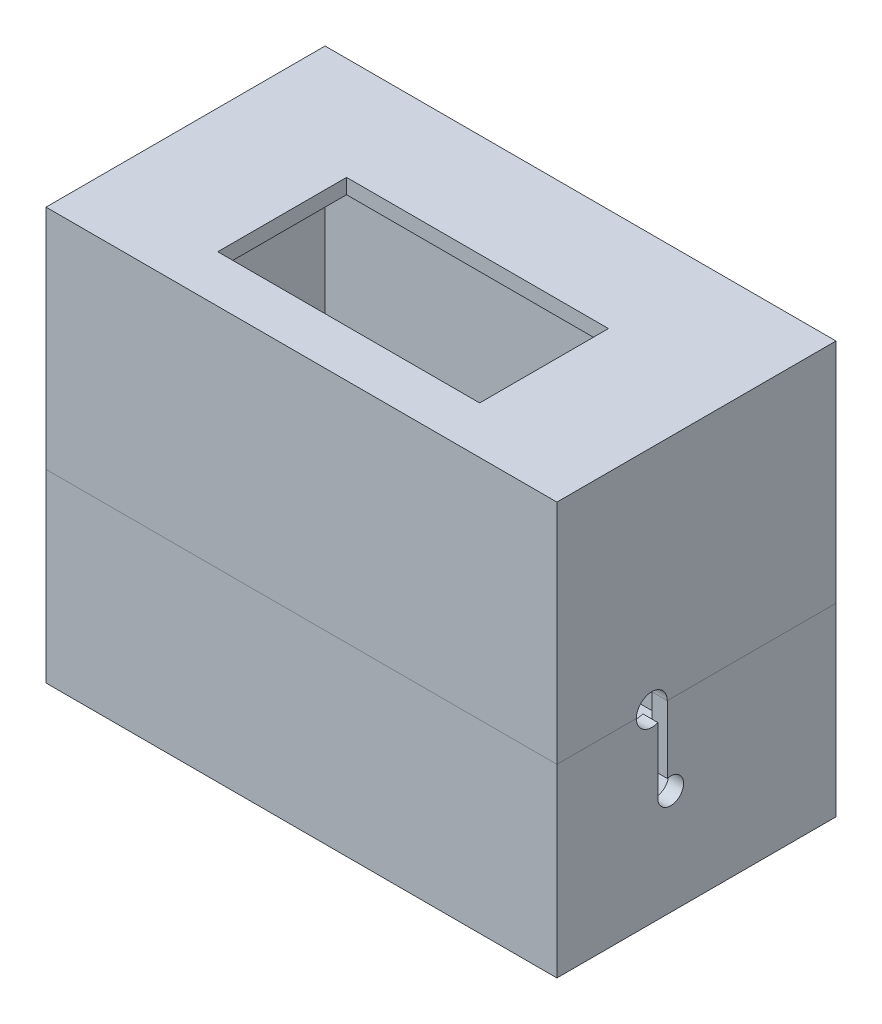
ISO-10303-21;
HEADER;
FILE_DESCRIPTION(('STEP AP214'),'2;1');
FILE_NAME('part.step','',(''),(''),'','','');
FILE_SCHEMA(('AUTOMOTIVE_DESIGN { 1 0 10303 214 1 1 1 1 }'));
ENDSEC;
DATA;
#1=APPLICATION_CONTEXT('core data for automotive mechanical design processes');
#2=APPLICATION_PROTOCOL_DEFINITION('international standard','automotive_design',2000,#1);
#3=PRODUCT_CONTEXT('',#1,'mechanical');
#4=PRODUCT('Part','Part','',(#3));
#5=PRODUCT_RELATED_PRODUCT_CATEGORY('part','',(#4));
#6=PRODUCT_DEFINITION_FORMATION('','',#4);
#7=PRODUCT_DEFINITION_CONTEXT('part definition',#1,'design');
#8=PRODUCT_DEFINITION('design','',#6,#7);
#9=PRODUCT_DEFINITION_SHAPE('','',#8);
#10=(LENGTH_UNIT() NAMED_UNIT(*) SI_UNIT(.MILLI.,.METRE.));
#11=(NAMED_UNIT(*) PLANE_ANGLE_UNIT() SI_UNIT($,.RADIAN.));
#12=(NAMED_UNIT(*) SI_UNIT($,.STERADIAN.) SOLID_ANGLE_UNIT());
#13=UNCERTAINTY_MEASURE_WITH_UNIT(LENGTH_MEASURE(1.E-05),#10,'distance_accuracy_value','');
#14=(GEOMETRIC_REPRESENTATION_CONTEXT(3) GLOBAL_UNCERTAINTY_ASSIGNED_CONTEXT((#13)) GLOBAL_UNIT_ASSIGNED_CONTEXT((#10,
#11,#12)) REPRESENTATION_CONTEXT('',''));
#15=CARTESIAN_POINT('',(0.,0.,0.));
#16=DIRECTION('',(0.,0.,1.));
#17=DIRECTION('',(1.,0.,0.));
#18=AXIS2_PLACEMENT_3D('',#15,#16,#17);
#19=CARTESIAN_POINT('',(0.,39.6,0.));
#20=DIRECTION('',(0.,-1.,0.));
#21=DIRECTION('',(0.,0.,-1.));
#22=AXIS2_PLACEMENT_3D('',#19,#20,#21);
#23=PLANE('',#22);
#24=DIRECTION('',(0.,0.,1.));
#25=VECTOR('',#24,1.);
#26=CARTESIAN_POINT('',(56.,39.6,29.));
#27=LINE('',#26,#25);
#28=CARTESIAN_POINT('',(56.,39.6,-29.));
#29=VERTEX_POINT('',#28);
#30=CARTESIAN_POINT('',(56.,39.6,6.8));
#31=VERTEX_POINT('',#30);
#32=EDGE_CURVE('E176',#29,#31,#27,.T.);
#33=ORIENTED_EDGE('',*,*,#32,.F.);
#34=DIRECTION('',(1.,0.,0.));
#35=VECTOR('',#34,1.);
#36=CARTESIAN_POINT('',(56.,39.6,-29.));
#37=LINE('',#36,#35);
#38=CARTESIAN_POINT('',(-56.,39.6,-29.));
#39=VERTEX_POINT('',#38);
#40=EDGE_CURVE('E239',#39,#29,#37,.T.);
#41=ORIENTED_EDGE('',*,*,#40,.F.);
#42=DIRECTION('',(0.,0.,-1.));
#43=VECTOR('',#42,1.);
#44=CARTESIAN_POINT('',(-56.,39.6,29.));
#45=LINE('',#44,#43);
#46=CARTESIAN_POINT('',(-56.,39.6,29.));
#47=VERTEX_POINT('',#46);
#48=EDGE_CURVE('E245',#47,#39,#45,.T.);
#49=ORIENTED_EDGE('',*,*,#48,.F.);
#50=DIRECTION('',(-1.,0.,0.));
#51=VECTOR('',#50,1.);
#52=CARTESIAN_POINT('',(56.,39.6,29.));
#53=LINE('',#52,#51);
#54=CARTESIAN_POINT('',(56.,39.6,29.));
#55=VERTEX_POINT('',#54);
#56=EDGE_CURVE('E242',#55,#47,#53,.T.);
#57=ORIENTED_EDGE('',*,*,#56,.F.);
#58=CARTESIAN_POINT('',(56.,39.6,14.));
#59=VERTEX_POINT('',#58);
#60=EDGE_CURVE('E249',#59,#55,#27,.T.);
#61=ORIENTED_EDGE('',*,*,#60,.F.);
#62=DIRECTION('',(-1.,0.,0.));
#63=VECTOR('',#62,1.);
#64=CARTESIAN_POINT('',(59.501,39.6,14.));
#65=LINE('',#64,#63);
#66=CARTESIAN_POINT('',(59.5,39.6,14.));
#67=VERTEX_POINT('',#66);
#68=EDGE_CURVE('E235',#67,#59,#65,.T.);
#69=ORIENTED_EDGE('',*,*,#68,.F.);
#70=DIRECTION('',(0.,0.,1.));
#71=VECTOR('',#70,1.);
#72=CARTESIAN_POINT('',(59.5,39.6,29.));
#73=LINE('',#72,#71);
#74=CARTESIAN_POINT('',(59.5,39.6,32.5));
#75=VERTEX_POINT('',#74);
#76=EDGE_CURVE('E161',#67,#75,#73,.T.);
#77=ORIENTED_EDGE('',*,*,#76,.T.);
#78=DIRECTION('',(-1.,0.,0.));
#79=VECTOR('',#78,1.);
#80=CARTESIAN_POINT('',(56.,39.6,32.5));
#81=LINE('',#80,#79);
#82=CARTESIAN_POINT('',(-59.5,39.6,32.5));
#83=VERTEX_POINT('',#82);
#84=EDGE_CURVE('E184',#75,#83,#81,.T.);
#85=ORIENTED_EDGE('',*,*,#84,.T.);
#86=DIRECTION('',(0.,0.,-1.));
#87=VECTOR('',#86,1.);
#88=CARTESIAN_POINT('',(-59.5,39.6,29.));
#89=LINE('',#88,#87);
#90=CARTESIAN_POINT('',(-59.5,39.6,-32.5));
#91=VERTEX_POINT('',#90);
#92=EDGE_CURVE('E253',#83,#91,#89,.T.);
#93=ORIENTED_EDGE('',*,*,#92,.T.);
#94=DIRECTION('',(1.,0.,0.));
#95=VECTOR('',#94,1.);
#96=CARTESIAN_POINT('',(56.,39.6,-32.5));
#97=LINE('',#96,#95);
#98=CARTESIAN_POINT('',(59.5,39.6,-32.5));
#99=VERTEX_POINT('',#98);
#100=EDGE_CURVE('E174',#91,#99,#97,.T.);
#101=ORIENTED_EDGE('',*,*,#100,.T.);
#102=CARTESIAN_POINT('',(59.5,39.6,6.8));
#103=VERTEX_POINT('',#102);
#104=EDGE_CURVE('E158',#99,#103,#73,.T.);
#105=ORIENTED_EDGE('',*,*,#104,.T.);
#106=DIRECTION('',(-1.,0.,0.));
#107=VECTOR('',#106,1.);
#108=CARTESIAN_POINT('',(59.501,39.6,6.8));
#109=LINE('',#108,#107);
#110=EDGE_CURVE('E171',#103,#31,#109,.T.);
#111=ORIENTED_EDGE('',*,*,#110,.T.);
#112=EDGE_LOOP('',(#33,#41,#49,#57,#61,#69,#77,#85,#93,#101,#105,#111));
#113=FACE_BOUND('',#112,.T.);
#114=ADVANCED_FACE('F48',(#113),#23,.T.);
#115=CARTESIAN_POINT('',(56.,89.,29.));
#116=DIRECTION('',(-1.,0.,0.));
#117=DIRECTION('',(0.,0.,1.));
#118=AXIS2_PLACEMENT_3D('',#115,#116,#117);
#119=PLANE('',#118);
#120=DIRECTION('',(0.,-1.,0.));
#121=VECTOR('',#120,1.);
#122=CARTESIAN_POINT('',(56.,89.,-29.));
#123=LINE('',#122,#121);
#124=CARTESIAN_POINT('',(56.,89.,-29.));
#125=VERTEX_POINT('',#124);
#126=EDGE_CURVE('E259',#125,#29,#123,.T.);
#127=ORIENTED_EDGE('',*,*,#126,.T.);
#128=ORIENTED_EDGE('',*,*,#32,.T.);
#129=CARTESIAN_POINT('',(56.,39.6,10.4));
#130=DIRECTION('',(1.,0.,0.));
#131=DIRECTION('',(0.,0.,-1.));
#132=AXIS2_PLACEMENT_3D('',#129,#130,#131);
#133=CIRCLE('',#132,3.6);
#134=EDGE_CURVE('E167',#31,#59,#133,.T.);
#135=ORIENTED_EDGE('',*,*,#134,.T.);
#136=ORIENTED_EDGE('',*,*,#60,.T.);
#137=DIRECTION('',(0.,-1.,0.));
#138=VECTOR('',#137,1.);
#139=CARTESIAN_POINT('',(56.,89.,29.));
#140=LINE('',#139,#138);
#141=CARTESIAN_POINT('',(56.,89.,29.));
#142=VERTEX_POINT('',#141);
#143=EDGE_CURVE('E263',#142,#55,#140,.T.);
#144=ORIENTED_EDGE('',*,*,#143,.F.);
#145=DIRECTION('',(0.,0.,-1.));
#146=VECTOR('',#145,1.);
#147=CARTESIAN_POINT('',(56.,89.,29.));
#148=LINE('',#147,#146);
#149=EDGE_CURVE('E296',#142,#125,#148,.T.);
#150=ORIENTED_EDGE('',*,*,#149,.T.);
#151=EDGE_LOOP('',(#127,#128,#135,#136,#144,#150));
#152=FACE_BOUND('',#151,.T.);
#153=ADVANCED_FACE('F321',(#152),#119,.T.);
#154=CARTESIAN_POINT('',(-56.,89.,29.));
#155=DIRECTION('',(1.,0.,0.));
#156=DIRECTION('',(0.,0.,-1.));
#157=AXIS2_PLACEMENT_3D('',#154,#155,#156);
#158=PLANE('',#157);
#159=DIRECTION('',(0.,-1.,0.));
#160=VECTOR('',#159,1.);
#161=CARTESIAN_POINT('',(-56.,89.,29.));
#162=LINE('',#161,#160);
#163=CARTESIAN_POINT('',(-56.,89.,29.));
#164=VERTEX_POINT('',#163);
#165=EDGE_CURVE('E268',#164,#47,#162,.T.);
#166=ORIENTED_EDGE('',*,*,#165,.T.);
#167=ORIENTED_EDGE('',*,*,#48,.T.);
#168=DIRECTION('',(0.,-1.,0.));
#169=VECTOR('',#168,1.);
#170=CARTESIAN_POINT('',(-56.,89.,-29.));
#171=LINE('',#170,#169);
#172=CARTESIAN_POINT('',(-56.,89.,-29.));
#173=VERTEX_POINT('',#172);
#174=EDGE_CURVE('E272',#173,#39,#171,.T.);
#175=ORIENTED_EDGE('',*,*,#174,.F.);
#176=DIRECTION('',(0.,0.,1.));
#177=VECTOR('',#176,1.);
#178=CARTESIAN_POINT('',(-56.,89.,29.));
#179=LINE('',#178,#177);
#180=EDGE_CURVE('E264',#173,#164,#179,.T.);
#181=ORIENTED_EDGE('',*,*,#180,.T.);
#182=EDGE_LOOP('',(#166,#167,#175,#181));
#183=FACE_BOUND('',#182,.T.);
#184=ADVANCED_FACE('F308',(#183),#158,.T.);
#185=CARTESIAN_POINT('',(56.,89.,29.));
#186=DIRECTION('',(0.,0.,-1.));
#187=DIRECTION('',(-1.,0.,0.));
#188=AXIS2_PLACEMENT_3D('',#185,#186,#187);
#189=PLANE('',#188);
#190=ORIENTED_EDGE('',*,*,#143,.T.);
#191=ORIENTED_EDGE('',*,*,#56,.T.);
#192=ORIENTED_EDGE('',*,*,#165,.F.);
#193=DIRECTION('',(1.,0.,0.));
#194=VECTOR('',#193,1.);
#195=CARTESIAN_POINT('',(56.,89.,29.));
#196=LINE('',#195,#194);
#197=EDGE_CURVE('E299',#164,#142,#196,.T.);
#198=ORIENTED_EDGE('',*,*,#197,.T.);
#199=EDGE_LOOP('',(#190,#191,#192,#198));
#200=FACE_BOUND('',#199,.T.);
#201=ADVANCED_FACE('F50',(#200),#189,.T.);
#202=CARTESIAN_POINT('',(56.,89.,-29.));
#203=DIRECTION('',(0.,0.,1.));
#204=DIRECTION('',(1.,0.,0.));
#205=AXIS2_PLACEMENT_3D('',#202,#203,#204);
#206=PLANE('',#205);
#207=ORIENTED_EDGE('',*,*,#174,.T.);
#208=ORIENTED_EDGE('',*,*,#40,.T.);
#209=ORIENTED_EDGE('',*,*,#126,.F.);
#210=DIRECTION('',(-1.,0.,0.));
#211=VECTOR('',#210,1.);
#212=CARTESIAN_POINT('',(56.,89.,-29.));
#213=LINE('',#212,#211);
#214=EDGE_CURVE('E238',#125,#173,#213,.T.);
#215=ORIENTED_EDGE('',*,*,#214,.T.);
#216=EDGE_LOOP('',(#207,#208,#209,#215));
#217=FACE_BOUND('',#216,.T.);
#218=ADVANCED_FACE('F316',(#217),#206,.T.);
#219=CARTESIAN_POINT('',(59.501,39.6,10.4));
#220=DIRECTION('',(-1.,0.,0.));
#221=DIRECTION('',(0.,0.,1.));
#222=AXIS2_PLACEMENT_3D('',#219,#220,#221);
#223=CYLINDRICAL_SURFACE('',#222,3.6);
#224=CARTESIAN_POINT('',(59.5,39.6,10.4));
#225=DIRECTION('',(-1.,0.,0.));
#226=DIRECTION('',(0.,0.,1.));
#227=AXIS2_PLACEMENT_3D('',#224,#225,#226);
#228=CIRCLE('',#227,3.6);
#229=EDGE_CURVE('E52',#67,#103,#228,.T.);
#230=ORIENTED_EDGE('',*,*,#229,.F.);
#231=ORIENTED_EDGE('',*,*,#68,.T.);
#232=ORIENTED_EDGE('',*,*,#134,.F.);
#233=ORIENTED_EDGE('',*,*,#110,.F.);
#234=EDGE_LOOP('',(#230,#231,#232,#233));
#235=FACE_BOUND('',#234,.T.);
#236=ADVANCED_FACE('F178',(#235),#223,.F.);
#237=CARTESIAN_POINT('',(59.5,89.,29.));
#238=DIRECTION('',(-1.,0.,0.));
#239=DIRECTION('',(0.,0.,1.));
#240=AXIS2_PLACEMENT_3D('',#237,#238,#239);
#241=PLANE('',#240);
#242=ORIENTED_EDGE('',*,*,#104,.F.);
#243=DIRECTION('',(0.,-1.,0.));
#244=VECTOR('',#243,1.);
#245=CARTESIAN_POINT('',(59.5,89.,-32.5));
#246=LINE('',#245,#244);
#247=CARTESIAN_POINT('',(59.5,92.5,-32.5));
#248=VERTEX_POINT('',#247);
#249=EDGE_CURVE('E281',#248,#99,#246,.T.);
#250=ORIENTED_EDGE('',*,*,#249,.F.);
#251=DIRECTION('',(0.,0.,-1.));
#252=VECTOR('',#251,1.);
#253=CARTESIAN_POINT('',(59.5,92.5,29.));
#254=LINE('',#253,#252);
#255=CARTESIAN_POINT('',(59.5,92.5,32.5));
#256=VERTEX_POINT('',#255);
#257=EDGE_CURVE('E201',#256,#248,#254,.T.);
#258=ORIENTED_EDGE('',*,*,#257,.F.);
#259=DIRECTION('',(0.,-1.,0.));
#260=VECTOR('',#259,1.);
#261=CARTESIAN_POINT('',(59.5,89.,32.5));
#262=LINE('',#261,#260);
#263=EDGE_CURVE('E279',#256,#75,#262,.T.);
#264=ORIENTED_EDGE('',*,*,#263,.T.);
#265=ORIENTED_EDGE('',*,*,#76,.F.);
#266=ORIENTED_EDGE('',*,*,#229,.T.);
#267=EDGE_LOOP('',(#242,#250,#258,#264,#265,#266));
#268=FACE_BOUND('',#267,.T.);
#269=ADVANCED_FACE('F156',(#268),#241,.F.);
#270=CARTESIAN_POINT('',(-59.5,89.,29.));
#271=DIRECTION('',(1.,0.,0.));
#272=DIRECTION('',(0.,0.,-1.));
#273=AXIS2_PLACEMENT_3D('',#270,#271,#272);
#274=PLANE('',#273);
#275=ORIENTED_EDGE('',*,*,#92,.F.);
#276=DIRECTION('',(0.,-1.,0.));
#277=VECTOR('',#276,1.);
#278=CARTESIAN_POINT('',(-59.5,89.,32.5));
#279=LINE('',#278,#277);
#280=CARTESIAN_POINT('',(-59.5,92.5,32.5));
#281=VERTEX_POINT('',#280);
#282=EDGE_CURVE('E276',#281,#83,#279,.T.);
#283=ORIENTED_EDGE('',*,*,#282,.F.);
#284=DIRECTION('',(0.,0.,1.));
#285=VECTOR('',#284,1.);
#286=CARTESIAN_POINT('',(-59.5,92.5,29.));
#287=LINE('',#286,#285);
#288=CARTESIAN_POINT('',(-59.5,92.5,-32.5));
#289=VERTEX_POINT('',#288);
#290=EDGE_CURVE('E190',#289,#281,#287,.T.);
#291=ORIENTED_EDGE('',*,*,#290,.F.);
#292=DIRECTION('',(0.,-1.,0.));
#293=VECTOR('',#292,1.);
#294=CARTESIAN_POINT('',(-59.5,89.,-32.5));
#295=LINE('',#294,#293);
#296=EDGE_CURVE('E187',#289,#91,#295,.T.);
#297=ORIENTED_EDGE('',*,*,#296,.T.);
#298=EDGE_LOOP('',(#275,#283,#291,#297));
#299=FACE_BOUND('',#298,.T.);
#300=ADVANCED_FACE('F328',(#299),#274,.F.);
#301=CARTESIAN_POINT('',(56.,89.,32.5));
#302=DIRECTION('',(0.,0.,-1.));
#303=DIRECTION('',(-1.,0.,0.));
#304=AXIS2_PLACEMENT_3D('',#301,#302,#303);
#305=PLANE('',#304);
#306=ORIENTED_EDGE('',*,*,#84,.F.);
#307=ORIENTED_EDGE('',*,*,#263,.F.);
#308=DIRECTION('',(1.,0.,0.));
#309=VECTOR('',#308,1.);
#310=CARTESIAN_POINT('',(56.,92.5,32.5));
#311=LINE('',#310,#309);
#312=EDGE_CURVE('E195',#281,#256,#311,.T.);
#313=ORIENTED_EDGE('',*,*,#312,.F.);
#314=ORIENTED_EDGE('',*,*,#282,.T.);
#315=EDGE_LOOP('',(#306,#307,#313,#314));
#316=FACE_BOUND('',#315,.T.);
#317=ADVANCED_FACE('F326',(#316),#305,.F.);
#318=CARTESIAN_POINT('',(56.,89.,-32.5));
#319=DIRECTION('',(0.,0.,1.));
#320=DIRECTION('',(1.,0.,0.));
#321=AXIS2_PLACEMENT_3D('',#318,#319,#320);
#322=PLANE('',#321);
#323=ORIENTED_EDGE('',*,*,#100,.F.);
#324=ORIENTED_EDGE('',*,*,#296,.F.);
#325=DIRECTION('',(-1.,0.,0.));
#326=VECTOR('',#325,1.);
#327=CARTESIAN_POINT('',(56.,92.5,-32.5));
#328=LINE('',#327,#326);
#329=EDGE_CURVE('E286',#248,#289,#328,.T.);
#330=ORIENTED_EDGE('',*,*,#329,.F.);
#331=ORIENTED_EDGE('',*,*,#249,.T.);
#332=EDGE_LOOP('',(#323,#324,#330,#331));
#333=FACE_BOUND('',#332,.T.);
#334=ADVANCED_FACE('F329',(#333),#322,.F.);
#335=CARTESIAN_POINT('',(0.,89.,0.));
#336=DIRECTION('',(0.,1.,0.));
#337=DIRECTION('',(0.,0.,1.));
#338=AXIS2_PLACEMENT_3D('',#335,#336,#337);
#339=PLANE('',#338);
#340=ORIENTED_EDGE('',*,*,#180,.F.);
#341=ORIENTED_EDGE('',*,*,#214,.F.);
#342=ORIENTED_EDGE('',*,*,#149,.F.);
#343=ORIENTED_EDGE('',*,*,#197,.F.);
#344=EDGE_LOOP('',(#340,#341,#342,#343));
#345=FACE_BOUND('',#344,.T.);
#346=DIRECTION('',(-1.,0.,0.));
#347=VECTOR('',#346,1.);
#348=CARTESIAN_POINT('',(-30.5,89.,21.5));
#349=LINE('',#348,#347);
#350=CARTESIAN_POINT('',(30.5,89.,21.5));
#351=VERTEX_POINT('',#350);
#352=CARTESIAN_POINT('',(-30.5,89.,21.5));
#353=VERTEX_POINT('',#352);
#354=EDGE_CURVE('E221',#351,#353,#349,.T.);
#355=ORIENTED_EDGE('',*,*,#354,.F.);
#356=DIRECTION('',(0.,0.,1.));
#357=VECTOR('',#356,1.);
#358=CARTESIAN_POINT('',(30.5,89.,-8.50000000000001));
#359=LINE('',#358,#357);
#360=CARTESIAN_POINT('',(30.5,89.,-8.50000000000001));
#361=VERTEX_POINT('',#360);
#362=EDGE_CURVE('E166',#361,#351,#359,.T.);
#363=ORIENTED_EDGE('',*,*,#362,.F.);
#364=DIRECTION('',(1.,0.,0.));
#365=VECTOR('',#364,1.);
#366=CARTESIAN_POINT('',(-30.5,89.,-8.50000000000001));
#367=LINE('',#366,#365);
#368=CARTESIAN_POINT('',(-30.5,89.,-8.50000000000001));
#369=VERTEX_POINT('',#368);
#370=EDGE_CURVE('E215',#369,#361,#367,.T.);
#371=ORIENTED_EDGE('',*,*,#370,.F.);
#372=DIRECTION('',(0.,0.,-1.));
#373=VECTOR('',#372,1.);
#374=CARTESIAN_POINT('',(-30.5,89.,-8.50000000000001));
#375=LINE('',#374,#373);
#376=EDGE_CURVE('E218',#353,#369,#375,.T.);
#377=ORIENTED_EDGE('',*,*,#376,.F.);
#378=EDGE_LOOP('',(#355,#363,#371,#377));
#379=FACE_BOUND('',#378,.T.);
#380=ADVANCED_FACE('F319',(#345,#379),#339,.F.);
#381=CARTESIAN_POINT('',(0.,92.5,0.));
#382=DIRECTION('',(0.,1.,0.));
#383=DIRECTION('',(0.,0.,1.));
#384=AXIS2_PLACEMENT_3D('',#381,#382,#383);
#385=PLANE('',#384);
#386=DIRECTION('',(0.,0.,1.));
#387=VECTOR('',#386,1.);
#388=CARTESIAN_POINT('',(-30.5,92.5,-8.50000000000001));
#389=LINE('',#388,#387);
#390=CARTESIAN_POINT('',(-30.5,92.5,-8.50000000000001));
#391=VERTEX_POINT('',#390);
#392=CARTESIAN_POINT('',(-30.5,92.5,21.5));
#393=VERTEX_POINT('',#392);
#394=EDGE_CURVE('E208',#391,#393,#389,.T.);
#395=ORIENTED_EDGE('',*,*,#394,.F.);
#396=DIRECTION('',(-1.,0.,0.));
#397=VECTOR('',#396,1.);
#398=CARTESIAN_POINT('',(-30.5,92.5,-8.50000000000001));
#399=LINE('',#398,#397);
#400=CARTESIAN_POINT('',(30.5,92.5,-8.50000000000001));
#401=VERTEX_POINT('',#400);
#402=EDGE_CURVE('E230',#401,#391,#399,.T.);
#403=ORIENTED_EDGE('',*,*,#402,.F.);
#404=DIRECTION('',(0.,0.,-1.));
#405=VECTOR('',#404,1.);
#406=CARTESIAN_POINT('',(30.5,92.5,-8.50000000000001));
#407=LINE('',#406,#405);
#408=CARTESIAN_POINT('',(30.5,92.5,21.5));
#409=VERTEX_POINT('',#408);
#410=EDGE_CURVE('E227',#409,#401,#407,.T.);
#411=ORIENTED_EDGE('',*,*,#410,.F.);
#412=DIRECTION('',(1.,0.,0.));
#413=VECTOR('',#412,1.);
#414=CARTESIAN_POINT('',(-30.5,92.5,21.5));
#415=LINE('',#414,#413);
#416=EDGE_CURVE('E224',#393,#409,#415,.T.);
#417=ORIENTED_EDGE('',*,*,#416,.F.);
#418=EDGE_LOOP('',(#395,#403,#411,#417));
#419=FACE_BOUND('',#418,.T.);
#420=ORIENTED_EDGE('',*,*,#290,.T.);
#421=ORIENTED_EDGE('',*,*,#312,.T.);
#422=ORIENTED_EDGE('',*,*,#257,.T.);
#423=ORIENTED_EDGE('',*,*,#329,.T.);
#424=EDGE_LOOP('',(#420,#421,#422,#423));
#425=FACE_BOUND('',#424,.T.);
#426=ADVANCED_FACE('F336',(#419,#425),#385,.T.);
#427=CARTESIAN_POINT('',(-30.5,-3.501,-8.50000000000001));
#428=DIRECTION('',(-1.,0.,0.));
#429=DIRECTION('',(0.,0.,1.));
#430=AXIS2_PLACEMENT_3D('',#427,#428,#429);
#431=PLANE('',#430);
#432=ORIENTED_EDGE('',*,*,#376,.T.);
#433=DIRECTION('',(0.,1.,0.));
#434=VECTOR('',#433,1.);
#435=CARTESIAN_POINT('',(-30.5,-3.501,-8.50000000000001));
#436=LINE('',#435,#434);
#437=EDGE_CURVE('E58',#369,#391,#436,.T.);
#438=ORIENTED_EDGE('',*,*,#437,.T.);
#439=ORIENTED_EDGE('',*,*,#394,.T.);
#440=DIRECTION('',(0.,1.,0.));
#441=VECTOR('',#440,1.);
#442=CARTESIAN_POINT('',(-30.5,-3.501,21.5));
#443=LINE('',#442,#441);
#444=EDGE_CURVE('E12',#353,#393,#443,.T.);
#445=ORIENTED_EDGE('',*,*,#444,.F.);
#446=EDGE_LOOP('',(#432,#438,#439,#445));
#447=FACE_BOUND('',#446,.T.);
#448=ADVANCED_FACE('F382',(#447),#431,.F.);
#449=CARTESIAN_POINT('',(-30.5,-3.501,-8.50000000000001));
#450=DIRECTION('',(0.,0.,-1.));
#451=DIRECTION('',(-1.,0.,0.));
#452=AXIS2_PLACEMENT_3D('',#449,#450,#451);
#453=PLANE('',#452);
#454=ORIENTED_EDGE('',*,*,#370,.T.);
#455=DIRECTION('',(0.,1.,0.));
#456=VECTOR('',#455,1.);
#457=CARTESIAN_POINT('',(30.5,-3.501,-8.50000000000001));
#458=LINE('',#457,#456);
#459=EDGE_CURVE('E207',#361,#401,#458,.T.);
#460=ORIENTED_EDGE('',*,*,#459,.T.);
#461=ORIENTED_EDGE('',*,*,#402,.T.);
#462=ORIENTED_EDGE('',*,*,#437,.F.);
#463=EDGE_LOOP('',(#454,#460,#461,#462));
#464=FACE_BOUND('',#463,.T.);
#465=ADVANCED_FACE('F392',(#464),#453,.F.);
#466=CARTESIAN_POINT('',(30.5,-3.501,-8.50000000000001));
#467=DIRECTION('',(1.,0.,0.));
#468=DIRECTION('',(0.,0.,-1.));
#469=AXIS2_PLACEMENT_3D('',#466,#467,#468);
#470=PLANE('',#469);
#471=ORIENTED_EDGE('',*,*,#362,.T.);
#472=DIRECTION('',(0.,1.,0.));
#473=VECTOR('',#472,1.);
#474=CARTESIAN_POINT('',(30.5,-3.501,21.5));
#475=LINE('',#474,#473);
#476=EDGE_CURVE('E81',#351,#409,#475,.T.);
#477=ORIENTED_EDGE('',*,*,#476,.T.);
#478=ORIENTED_EDGE('',*,*,#410,.T.);
#479=ORIENTED_EDGE('',*,*,#459,.F.);
#480=EDGE_LOOP('',(#471,#477,#478,#479));
#481=FACE_BOUND('',#480,.T.);
#482=ADVANCED_FACE('F401',(#481),#470,.F.);
#483=CARTESIAN_POINT('',(-30.5,-3.501,21.5));
#484=DIRECTION('',(0.,0.,1.));
#485=DIRECTION('',(1.,0.,0.));
#486=AXIS2_PLACEMENT_3D('',#483,#484,#485);
#487=PLANE('',#486);
#488=ORIENTED_EDGE('',*,*,#354,.T.);
#489=ORIENTED_EDGE('',*,*,#444,.T.);
#490=ORIENTED_EDGE('',*,*,#416,.T.);
#491=ORIENTED_EDGE('',*,*,#476,.F.);
#492=EDGE_LOOP('',(#488,#489,#490,#491));
#493=FACE_BOUND('',#492,.T.);
#494=ADVANCED_FACE('F348',(#493),#487,.F.);
#495=CLOSED_SHELL('',(#114,#153,#184,#201,#218,#236,#269,#300,#317,#334,#380,#426,#448,#465,
#482,#494));
#496=MANIFOLD_SOLID_BREP('B2',#495);
#497=CARTESIAN_POINT('',(0.,39.6,0.));
#498=DIRECTION('',(0.,-1.,0.));
#499=DIRECTION('',(0.,0.,-1.));
#500=AXIS2_PLACEMENT_3D('',#497,#498,#499);
#501=PLANE('',#500);
#502=DIRECTION('',(0.,0.,1.));
#503=VECTOR('',#502,1.);
#504=CARTESIAN_POINT('',(56.,39.6,29.));
#505=LINE('',#504,#503);
#506=CARTESIAN_POINT('',(56.,39.6,-29.));
#507=VERTEX_POINT('',#506);
#508=CARTESIAN_POINT('',(56.,39.6,6.8));
#509=VERTEX_POINT('',#508);
#510=EDGE_CURVE('E659',#507,#509,#505,.T.);
#511=ORIENTED_EDGE('',*,*,#510,.T.);
#512=DIRECTION('',(-1.,0.,0.));
#513=VECTOR('',#512,1.);
#514=CARTESIAN_POINT('',(59.501,39.6,6.8));
#515=LINE('',#514,#513);
#516=CARTESIAN_POINT('',(59.5,39.6,6.8));
#517=VERTEX_POINT('',#516);
#518=EDGE_CURVE('E609',#517,#509,#515,.T.);
#519=ORIENTED_EDGE('',*,*,#518,.F.);
#520=DIRECTION('',(0.,0.,1.));
#521=VECTOR('',#520,1.);
#522=CARTESIAN_POINT('',(59.5,39.6,29.));
#523=LINE('',#522,#521);
#524=CARTESIAN_POINT('',(59.5,39.6,-32.5));
#525=VERTEX_POINT('',#524);
#526=EDGE_CURVE('E657',#525,#517,#523,.T.);
#527=ORIENTED_EDGE('',*,*,#526,.F.);
#528=DIRECTION('',(1.,0.,0.));
#529=VECTOR('',#528,1.);
#530=CARTESIAN_POINT('',(56.,39.6,-32.5));
#531=LINE('',#530,#529);
#532=CARTESIAN_POINT('',(-59.5,39.6,-32.5));
#533=VERTEX_POINT('',#532);
#534=EDGE_CURVE('E634',#533,#525,#531,.T.);
#535=ORIENTED_EDGE('',*,*,#534,.F.);
#536=DIRECTION('',(0.,0.,-1.));
#537=VECTOR('',#536,1.);
#538=CARTESIAN_POINT('',(-59.5,39.6,29.));
#539=LINE('',#538,#537);
#540=CARTESIAN_POINT('',(-59.5,39.6,32.5));
#541=VERTEX_POINT('',#540);
#542=EDGE_CURVE('E654',#541,#533,#539,.T.);
#543=ORIENTED_EDGE('',*,*,#542,.F.);
#544=DIRECTION('',(-1.,0.,0.));
#545=VECTOR('',#544,1.);
#546=CARTESIAN_POINT('',(56.,39.6,32.5));
#547=LINE('',#546,#545);
#548=CARTESIAN_POINT('',(59.5,39.6,32.5));
#549=VERTEX_POINT('',#548);
#550=EDGE_CURVE('E653',#549,#541,#547,.T.);
#551=ORIENTED_EDGE('',*,*,#550,.F.);
#552=CARTESIAN_POINT('',(59.5,39.6,14.));
#553=VERTEX_POINT('',#552);
#554=EDGE_CURVE('E656',#553,#549,#523,.T.);
#555=ORIENTED_EDGE('',*,*,#554,.F.);
#556=DIRECTION('',(-1.,0.,0.));
#557=VECTOR('',#556,1.);
#558=CARTESIAN_POINT('',(59.501,39.6,14.));
#559=LINE('',#558,#557);
#560=CARTESIAN_POINT('',(56.,39.6,14.));
#561=VERTEX_POINT('',#560);
#562=EDGE_CURVE('E46',#553,#561,#559,.T.);
#563=ORIENTED_EDGE('',*,*,#562,.T.);
#564=CARTESIAN_POINT('',(56.,39.6,29.));
#565=VERTEX_POINT('',#564);
#566=EDGE_CURVE('E488',#561,#565,#505,.T.);
#567=ORIENTED_EDGE('',*,*,#566,.T.);
#568=DIRECTION('',(-1.,0.,0.));
#569=VECTOR('',#568,1.);
#570=CARTESIAN_POINT('',(56.,39.6,29.));
#571=LINE('',#570,#569);
#572=CARTESIAN_POINT('',(-56.,39.6,29.));
#573=VERTEX_POINT('',#572);
#574=EDGE_CURVE('E663',#565,#573,#571,.T.);
#575=ORIENTED_EDGE('',*,*,#574,.T.);
#576=DIRECTION('',(0.,0.,-1.));
#577=VECTOR('',#576,1.);
#578=CARTESIAN_POINT('',(-56.,39.6,29.));
#579=LINE('',#578,#577);
#580=CARTESIAN_POINT('',(-56.,39.6,-29.));
#581=VERTEX_POINT('',#580);
#582=EDGE_CURVE('E662',#573,#581,#579,.T.);
#583=ORIENTED_EDGE('',*,*,#582,.T.);
#584=DIRECTION('',(1.,0.,0.));
#585=VECTOR('',#584,1.);
#586=CARTESIAN_POINT('',(56.,39.6,-29.));
#587=LINE('',#586,#585);
#588=EDGE_CURVE('E476',#581,#507,#587,.T.);
#589=ORIENTED_EDGE('',*,*,#588,.T.);
#590=EDGE_LOOP('',(#511,#519,#527,#535,#543,#551,#555,#563,#567,#575,#583,#589));
#591=FACE_BOUND('',#590,.T.);
#592=ADVANCED_FACE('F473',(#591),#501,.F.);
#593=CARTESIAN_POINT('',(56.,89.,29.));
#594=DIRECTION('',(-1.,0.,0.));
#595=DIRECTION('',(0.,0.,1.));
#596=AXIS2_PLACEMENT_3D('',#593,#594,#595);
#597=PLANE('',#596);
#598=ORIENTED_EDGE('',*,*,#510,.F.);
#599=DIRECTION('',(0.,-1.,0.));
#600=VECTOR('',#599,1.);
#601=CARTESIAN_POINT('',(56.,89.,-29.));
#602=LINE('',#601,#600);
#603=CARTESIAN_POINT('',(56.,0.,-29.));
#604=VERTEX_POINT('',#603);
#605=EDGE_CURVE('E632',#507,#604,#602,.T.);
#606=ORIENTED_EDGE('',*,*,#605,.T.);
#607=DIRECTION('',(0.,0.,-1.));
#608=VECTOR('',#607,1.);
#609=CARTESIAN_POINT('',(56.,0.,29.));
#610=LINE('',#609,#608);
#611=CARTESIAN_POINT('',(56.,0.,29.));
#612=VERTEX_POINT('',#611);
#613=EDGE_CURVE('E640',#612,#604,#610,.T.);
#614=ORIENTED_EDGE('',*,*,#613,.F.);
#615=DIRECTION('',(0.,-1.,0.));
#616=VECTOR('',#615,1.);
#617=CARTESIAN_POINT('',(56.,89.,29.));
#618=LINE('',#617,#616);
#619=EDGE_CURVE('E638',#565,#612,#618,.T.);
#620=ORIENTED_EDGE('',*,*,#619,.F.);
#621=ORIENTED_EDGE('',*,*,#566,.F.);
#622=CARTESIAN_POINT('',(56.,39.6,10.4));
#623=DIRECTION('',(1.,0.,0.));
#624=DIRECTION('',(0.,0.,-1.));
#625=AXIS2_PLACEMENT_3D('',#622,#623,#624);
#626=CIRCLE('',#625,3.6);
#627=CARTESIAN_POINT('',(56.,36.2833752096446,9.));
#628=VERTEX_POINT('',#627);
#629=EDGE_CURVE('E605',#561,#628,#626,.T.);
#630=ORIENTED_EDGE('',*,*,#629,.T.);
#631=DIRECTION('',(0.,-1.,0.));
#632=VECTOR('',#631,1.);
#633=CARTESIAN_POINT('',(56.,21.,9.));
#634=LINE('',#633,#632);
#635=CARTESIAN_POINT('',(56.,21.,9.));
#636=VERTEX_POINT('',#635);
#637=EDGE_CURVE('E589',#628,#636,#634,.T.);
#638=ORIENTED_EDGE('',*,*,#637,.T.);
#639=CARTESIAN_POINT('',(56.,21.,6.));
#640=DIRECTION('',(1.,0.,0.));
#641=DIRECTION('',(0.,0.,-1.));
#642=AXIS2_PLACEMENT_3D('',#639,#640,#641);
#643=CIRCLE('',#642,3.);
#644=CARTESIAN_POINT('',(56.,23.8913664589602,6.8));
#645=VERTEX_POINT('',#644);
#646=EDGE_CURVE('E588',#636,#645,#643,.T.);
#647=ORIENTED_EDGE('',*,*,#646,.T.);
#648=DIRECTION('',(0.,1.,0.));
#649=VECTOR('',#648,1.);
#650=CARTESIAN_POINT('',(56.,39.6,6.8));
#651=LINE('',#650,#649);
#652=EDGE_CURVE('E597',#645,#509,#651,.T.);
#653=ORIENTED_EDGE('',*,*,#652,.T.);
#654=EDGE_LOOP('',(#598,#606,#614,#620,#621,#630,#638,#647,#653));
#655=FACE_BOUND('',#654,.T.);
#656=ADVANCED_FACE('F678',(#655),#597,.T.);
#657=CARTESIAN_POINT('',(59.501,39.6,10.4));
#658=DIRECTION('',(-1.,0.,0.));
#659=DIRECTION('',(0.,0.,1.));
#660=AXIS2_PLACEMENT_3D('',#657,#658,#659);
#661=CYLINDRICAL_SURFACE('',#660,3.6);
#662=ORIENTED_EDGE('',*,*,#562,.F.);
#663=CARTESIAN_POINT('',(59.5,39.6,10.4));
#664=DIRECTION('',(-1.,0.,0.));
#665=DIRECTION('',(0.,0.,1.));
#666=AXIS2_PLACEMENT_3D('',#663,#664,#665);
#667=CIRCLE('',#666,3.6);
#668=CARTESIAN_POINT('',(59.5,36.2833752096446,9.));
#669=VERTEX_POINT('',#668);
#670=EDGE_CURVE('E599',#669,#553,#667,.T.);
#671=ORIENTED_EDGE('',*,*,#670,.F.);
#672=DIRECTION('',(-1.,0.,0.));
#673=VECTOR('',#672,1.);
#674=CARTESIAN_POINT('',(59.501,36.2833752096446,9.));
#675=LINE('',#674,#673);
#676=EDGE_CURVE('E575',#669,#628,#675,.T.);
#677=ORIENTED_EDGE('',*,*,#676,.T.);
#678=ORIENTED_EDGE('',*,*,#629,.F.);
#679=EDGE_LOOP('',(#662,#671,#677,#678));
#680=FACE_BOUND('',#679,.T.);
#681=ADVANCED_FACE('F687',(#680),#661,.F.);
#682=CARTESIAN_POINT('',(59.501,21.,9.));
#683=DIRECTION('',(0.,0.,-1.));
#684=DIRECTION('',(-1.,0.,0.));
#685=AXIS2_PLACEMENT_3D('',#682,#683,#684);
#686=PLANE('',#685);
#687=DIRECTION('',(-1.,0.,0.));
#688=VECTOR('',#687,1.);
#689=CARTESIAN_POINT('',(59.501,21.,9.));
#690=LINE('',#689,#688);
#691=CARTESIAN_POINT('',(59.5,21.,9.));
#692=VERTEX_POINT('',#691);
#693=EDGE_CURVE('E572',#692,#636,#690,.T.);
#694=ORIENTED_EDGE('',*,*,#693,.T.);
#695=ORIENTED_EDGE('',*,*,#637,.F.);
#696=ORIENTED_EDGE('',*,*,#676,.F.);
#697=DIRECTION('',(0.,1.,0.));
#698=VECTOR('',#697,1.);
#699=CARTESIAN_POINT('',(59.5,21.,9.));
#700=LINE('',#699,#698);
#701=EDGE_CURVE('E568',#692,#669,#700,.T.);
#702=ORIENTED_EDGE('',*,*,#701,.F.);
#703=EDGE_LOOP('',(#694,#695,#696,#702));
#704=FACE_BOUND('',#703,.T.);
#705=ADVANCED_FACE('F570',(#704),#686,.T.);
#706=CARTESIAN_POINT('',(59.501,21.,6.));
#707=DIRECTION('',(-1.,0.,0.));
#708=DIRECTION('',(0.,0.,1.));
#709=AXIS2_PLACEMENT_3D('',#706,#707,#708);
#710=CYLINDRICAL_SURFACE('',#709,3.);
#711=DIRECTION('',(-1.,0.,0.));
#712=VECTOR('',#711,1.);
#713=CARTESIAN_POINT('',(59.501,23.8913664589602,6.8));
#714=LINE('',#713,#712);
#715=CARTESIAN_POINT('',(59.5,23.8913664589602,6.8));
#716=VERTEX_POINT('',#715);
#717=EDGE_CURVE('E581',#716,#645,#714,.T.);
#718=ORIENTED_EDGE('',*,*,#717,.T.);
#719=ORIENTED_EDGE('',*,*,#646,.F.);
#720=ORIENTED_EDGE('',*,*,#693,.F.);
#721=CARTESIAN_POINT('',(59.5,21.,6.));
#722=DIRECTION('',(-1.,0.,0.));
#723=DIRECTION('',(0.,0.,1.));
#724=AXIS2_PLACEMENT_3D('',#721,#722,#723);
#725=CIRCLE('',#724,3.);
#726=EDGE_CURVE('E585',#716,#692,#725,.T.);
#727=ORIENTED_EDGE('',*,*,#726,.F.);
#728=EDGE_LOOP('',(#718,#719,#720,#727));
#729=FACE_BOUND('',#728,.T.);
#730=ADVANCED_FACE('F584',(#729),#710,.F.);
#731=CARTESIAN_POINT('',(59.501,39.6,6.8));
#732=DIRECTION('',(0.,0.,1.));
#733=DIRECTION('',(0.,-1.,0.));
#734=AXIS2_PLACEMENT_3D('',#731,#732,#733);
#735=PLANE('',#734);
#736=ORIENTED_EDGE('',*,*,#518,.T.);
#737=ORIENTED_EDGE('',*,*,#652,.F.);
#738=ORIENTED_EDGE('',*,*,#717,.F.);
#739=DIRECTION('',(0.,-1.,0.));
#740=VECTOR('',#739,1.);
#741=CARTESIAN_POINT('',(59.5,39.6,6.8));
#742=LINE('',#741,#740);
#743=EDGE_CURVE('E595',#517,#716,#742,.T.);
#744=ORIENTED_EDGE('',*,*,#743,.F.);
#745=EDGE_LOOP('',(#736,#737,#738,#744));
#746=FACE_BOUND('',#745,.T.);
#747=ADVANCED_FACE('F684',(#746),#735,.T.);
#748=CARTESIAN_POINT('',(0.,-3.5,0.));
#749=DIRECTION('',(0.,1.,0.));
#750=DIRECTION('',(0.,0.,1.));
#751=AXIS2_PLACEMENT_3D('',#748,#749,#750);
#752=PLANE('',#751);
#753=DIRECTION('',(0.,0.,1.));
#754=VECTOR('',#753,1.);
#755=CARTESIAN_POINT('',(-59.5,-3.5,29.));
#756=LINE('',#755,#754);
#757=CARTESIAN_POINT('',(-59.5,-3.5,-32.5));
#758=VERTEX_POINT('',#757);
#759=CARTESIAN_POINT('',(-59.5,-3.5,32.5));
#760=VERTEX_POINT('',#759);
#761=EDGE_CURVE('E580',#758,#760,#756,.T.);
#762=ORIENTED_EDGE('',*,*,#761,.F.);
#763=DIRECTION('',(-1.,0.,0.));
#764=VECTOR('',#763,1.);
#765=CARTESIAN_POINT('',(56.,-3.5,-32.5));
#766=LINE('',#765,#764);
#767=CARTESIAN_POINT('',(59.5,-3.5,-32.5));
#768=VERTEX_POINT('',#767);
#769=EDGE_CURVE('E622',#768,#758,#766,.T.);
#770=ORIENTED_EDGE('',*,*,#769,.F.);
#771=DIRECTION('',(0.,0.,-1.));
#772=VECTOR('',#771,1.);
#773=CARTESIAN_POINT('',(59.5,-3.5,29.));
#774=LINE('',#773,#772);
#775=CARTESIAN_POINT('',(59.5,-3.5,32.5));
#776=VERTEX_POINT('',#775);
#777=EDGE_CURVE('E625',#776,#768,#774,.T.);
#778=ORIENTED_EDGE('',*,*,#777,.F.);
#779=DIRECTION('',(1.,0.,0.));
#780=VECTOR('',#779,1.);
#781=CARTESIAN_POINT('',(56.,-3.5,32.5));
#782=LINE('',#781,#780);
#783=EDGE_CURVE('E614',#760,#776,#782,.T.);
#784=ORIENTED_EDGE('',*,*,#783,.F.);
#785=EDGE_LOOP('',(#762,#770,#778,#784));
#786=FACE_BOUND('',#785,.T.);
#787=ADVANCED_FACE('F700',(#786),#752,.F.);
#788=CARTESIAN_POINT('',(59.5,89.,29.));
#789=DIRECTION('',(-1.,0.,0.));
#790=DIRECTION('',(0.,0.,1.));
#791=AXIS2_PLACEMENT_3D('',#788,#789,#790);
#792=PLANE('',#791);
#793=DIRECTION('',(0.,-1.,0.));
#794=VECTOR('',#793,1.);
#795=CARTESIAN_POINT('',(59.5,89.,-32.5));
#796=LINE('',#795,#794);
#797=EDGE_CURVE('E621',#525,#768,#796,.T.);
#798=ORIENTED_EDGE('',*,*,#797,.F.);
#799=ORIENTED_EDGE('',*,*,#526,.T.);
#800=ORIENTED_EDGE('',*,*,#743,.T.);
#801=ORIENTED_EDGE('',*,*,#726,.T.);
#802=ORIENTED_EDGE('',*,*,#701,.T.);
#803=ORIENTED_EDGE('',*,*,#670,.T.);
#804=ORIENTED_EDGE('',*,*,#554,.T.);
#805=DIRECTION('',(0.,-1.,0.));
#806=VECTOR('',#805,1.);
#807=CARTESIAN_POINT('',(59.5,89.,32.5));
#808=LINE('',#807,#806);
#809=EDGE_CURVE('E618',#549,#776,#808,.T.);
#810=ORIENTED_EDGE('',*,*,#809,.T.);
#811=ORIENTED_EDGE('',*,*,#777,.T.);
#812=EDGE_LOOP('',(#798,#799,#800,#801,#802,#803,#804,#810,#811));
#813=FACE_BOUND('',#812,.T.);
#814=ADVANCED_FACE('F593',(#813),#792,.F.);
#815=CARTESIAN_POINT('',(-59.5,89.,29.));
#816=DIRECTION('',(1.,0.,0.));
#817=DIRECTION('',(0.,0.,-1.));
#818=AXIS2_PLACEMENT_3D('',#815,#816,#817);
#819=PLANE('',#818);
#820=DIRECTION('',(0.,-1.,0.));
#821=VECTOR('',#820,1.);
#822=CARTESIAN_POINT('',(-59.5,89.,32.5));
#823=LINE('',#822,#821);
#824=EDGE_CURVE('E615',#541,#760,#823,.T.);
#825=ORIENTED_EDGE('',*,*,#824,.F.);
#826=ORIENTED_EDGE('',*,*,#542,.T.);
#827=DIRECTION('',(0.,-1.,0.));
#828=VECTOR('',#827,1.);
#829=CARTESIAN_POINT('',(-59.5,89.,-32.5));
#830=LINE('',#829,#828);
#831=EDGE_CURVE('E619',#533,#758,#830,.T.);
#832=ORIENTED_EDGE('',*,*,#831,.T.);
#833=ORIENTED_EDGE('',*,*,#761,.T.);
#834=EDGE_LOOP('',(#825,#826,#832,#833));
#835=FACE_BOUND('',#834,.T.);
#836=ADVANCED_FACE('F705',(#835),#819,.F.);
#837=CARTESIAN_POINT('',(56.,89.,-32.5));
#838=DIRECTION('',(0.,0.,1.));
#839=DIRECTION('',(1.,0.,0.));
#840=AXIS2_PLACEMENT_3D('',#837,#838,#839);
#841=PLANE('',#840);
#842=ORIENTED_EDGE('',*,*,#831,.F.);
#843=ORIENTED_EDGE('',*,*,#534,.T.);
#844=ORIENTED_EDGE('',*,*,#797,.T.);
#845=ORIENTED_EDGE('',*,*,#769,.T.);
#846=EDGE_LOOP('',(#842,#843,#844,#845));
#847=FACE_BOUND('',#846,.T.);
#848=ADVANCED_FACE('F703',(#847),#841,.F.);
#849=CARTESIAN_POINT('',(56.,89.,32.5));
#850=DIRECTION('',(0.,0.,-1.));
#851=DIRECTION('',(-1.,0.,0.));
#852=AXIS2_PLACEMENT_3D('',#849,#850,#851);
#853=PLANE('',#852);
#854=ORIENTED_EDGE('',*,*,#809,.F.);
#855=ORIENTED_EDGE('',*,*,#550,.T.);
#856=ORIENTED_EDGE('',*,*,#824,.T.);
#857=ORIENTED_EDGE('',*,*,#783,.T.);
#858=EDGE_LOOP('',(#854,#855,#856,#857));
#859=FACE_BOUND('',#858,.T.);
#860=ADVANCED_FACE('F694',(#859),#853,.F.);
#861=CARTESIAN_POINT('',(0.,0.,0.));
#862=DIRECTION('',(0.,1.,0.));
#863=DIRECTION('',(0.,0.,1.));
#864=AXIS2_PLACEMENT_3D('',#861,#862,#863);
#865=PLANE('',#864);
#866=DIRECTION('',(0.,0.,1.));
#867=VECTOR('',#866,1.);
#868=CARTESIAN_POINT('',(-56.,0.,29.));
#869=LINE('',#868,#867);
#870=CARTESIAN_POINT('',(-56.,0.,-29.));
#871=VERTEX_POINT('',#870);
#872=CARTESIAN_POINT('',(-56.,0.,29.));
#873=VERTEX_POINT('',#872);
#874=EDGE_CURVE('E617',#871,#873,#869,.T.);
#875=ORIENTED_EDGE('',*,*,#874,.T.);
#876=DIRECTION('',(1.,0.,0.));
#877=VECTOR('',#876,1.);
#878=CARTESIAN_POINT('',(56.,0.,29.));
#879=LINE('',#878,#877);
#880=EDGE_CURVE('E645',#873,#612,#879,.T.);
#881=ORIENTED_EDGE('',*,*,#880,.T.);
#882=ORIENTED_EDGE('',*,*,#613,.T.);
#883=DIRECTION('',(-1.,0.,0.));
#884=VECTOR('',#883,1.);
#885=CARTESIAN_POINT('',(56.,0.,-29.));
#886=LINE('',#885,#884);
#887=EDGE_CURVE('E635',#604,#871,#886,.T.);
#888=ORIENTED_EDGE('',*,*,#887,.T.);
#889=EDGE_LOOP('',(#875,#881,#882,#888));
#890=FACE_BOUND('',#889,.T.);
#891=ADVANCED_FACE('F675',(#890),#865,.T.);
#892=CARTESIAN_POINT('',(-56.,89.,29.));
#893=DIRECTION('',(1.,0.,0.));
#894=DIRECTION('',(0.,0.,-1.));
#895=AXIS2_PLACEMENT_3D('',#892,#893,#894);
#896=PLANE('',#895);
#897=ORIENTED_EDGE('',*,*,#582,.F.);
#898=DIRECTION('',(0.,-1.,0.));
#899=VECTOR('',#898,1.);
#900=CARTESIAN_POINT('',(-56.,89.,29.));
#901=LINE('',#900,#899);
#902=EDGE_CURVE('E643',#573,#873,#901,.T.);
#903=ORIENTED_EDGE('',*,*,#902,.T.);
#904=ORIENTED_EDGE('',*,*,#874,.F.);
#905=DIRECTION('',(0.,-1.,0.));
#906=VECTOR('',#905,1.);
#907=CARTESIAN_POINT('',(-56.,89.,-29.));
#908=LINE('',#907,#906);
#909=EDGE_CURVE('E648',#581,#871,#908,.T.);
#910=ORIENTED_EDGE('',*,*,#909,.F.);
#911=EDGE_LOOP('',(#897,#903,#904,#910));
#912=FACE_BOUND('',#911,.T.);
#913=ADVANCED_FACE('F669',(#912),#896,.T.);
#914=CARTESIAN_POINT('',(56.,89.,-29.));
#915=DIRECTION('',(0.,0.,1.));
#916=DIRECTION('',(1.,0.,0.));
#917=AXIS2_PLACEMENT_3D('',#914,#915,#916);
#918=PLANE('',#917);
#919=ORIENTED_EDGE('',*,*,#588,.F.);
#920=ORIENTED_EDGE('',*,*,#909,.T.);
#921=ORIENTED_EDGE('',*,*,#887,.F.);
#922=ORIENTED_EDGE('',*,*,#605,.F.);
#923=EDGE_LOOP('',(#919,#920,#921,#922));
#924=FACE_BOUND('',#923,.T.);
#925=ADVANCED_FACE('F672',(#924),#918,.T.);
#926=CARTESIAN_POINT('',(56.,89.,29.));
#927=DIRECTION('',(0.,0.,-1.));
#928=DIRECTION('',(-1.,0.,0.));
#929=AXIS2_PLACEMENT_3D('',#926,#927,#928);
#930=PLANE('',#929);
#931=ORIENTED_EDGE('',*,*,#574,.F.);
#932=ORIENTED_EDGE('',*,*,#619,.T.);
#933=ORIENTED_EDGE('',*,*,#880,.F.);
#934=ORIENTED_EDGE('',*,*,#902,.F.);
#935=EDGE_LOOP('',(#931,#932,#933,#934));
#936=FACE_BOUND('',#935,.T.);
#937=ADVANCED_FACE('F717',(#936),#930,.T.);
#938=CLOSED_SHELL('',(#592,#656,#681,#705,#730,#747,#787,#814,#836,#848,#860,#891,#913,#925,#937));
#939=MANIFOLD_SOLID_BREP('B6',#938);
#940=ADVANCED_BREP_SHAPE_REPRESENTATION('',(#18,#496,#939),#14);
#941=SHAPE_DEFINITION_REPRESENTATION(#9,#940);
ENDSEC;
END-ISO-10303-21;
